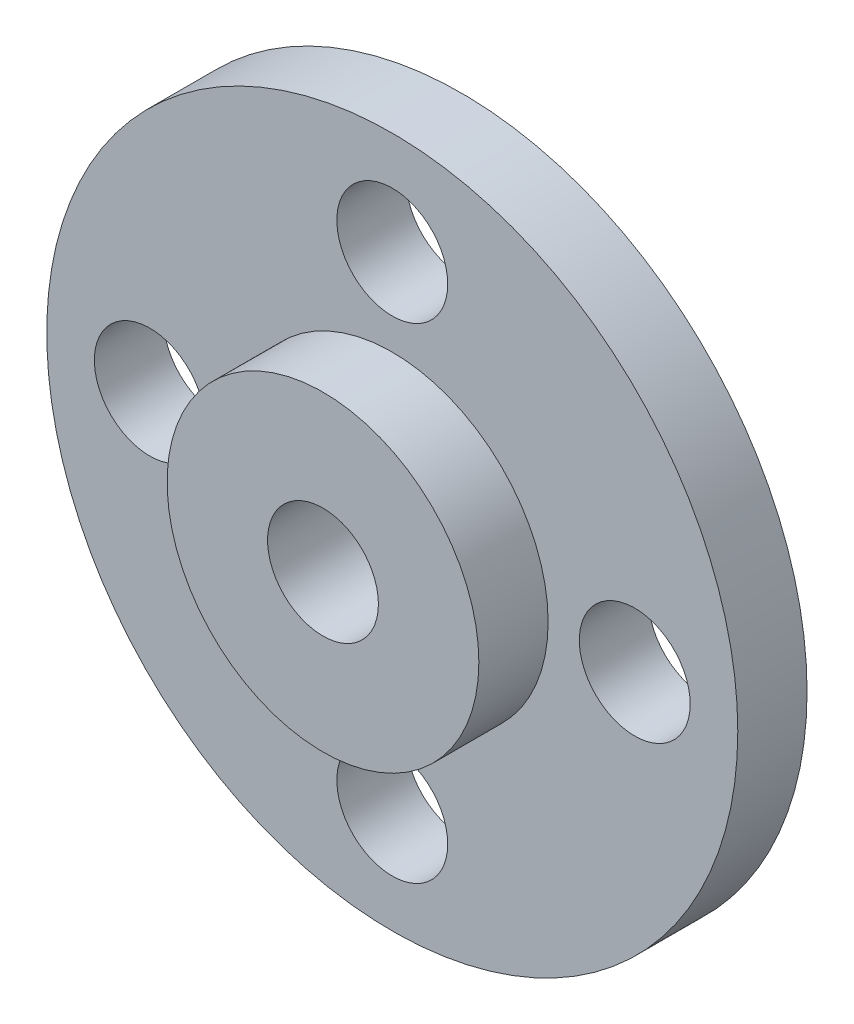
ISO-10303-21;
HEADER;
FILE_DESCRIPTION(('STEP AP214'),'2;1');
FILE_NAME('part.step','',(''),(''),'','','');
FILE_SCHEMA(('AUTOMOTIVE_DESIGN { 1 0 10303 214 1 1 1 1 }'));
ENDSEC;
DATA;
#1=APPLICATION_CONTEXT('core data for automotive mechanical design processes');
#2=APPLICATION_PROTOCOL_DEFINITION('international standard','automotive_design',2000,#1);
#3=PRODUCT_CONTEXT('',#1,'mechanical');
#4=PRODUCT('Part','Part','',(#3));
#5=PRODUCT_RELATED_PRODUCT_CATEGORY('part','',(#4));
#6=PRODUCT_DEFINITION_FORMATION('','',#4);
#7=PRODUCT_DEFINITION_CONTEXT('part definition',#1,'design');
#8=PRODUCT_DEFINITION('design','',#6,#7);
#9=PRODUCT_DEFINITION_SHAPE('','',#8);
#10=(LENGTH_UNIT() NAMED_UNIT(*) SI_UNIT(.MILLI.,.METRE.));
#11=(NAMED_UNIT(*) PLANE_ANGLE_UNIT() SI_UNIT($,.RADIAN.));
#12=(NAMED_UNIT(*) SI_UNIT($,.STERADIAN.) SOLID_ANGLE_UNIT());
#13=UNCERTAINTY_MEASURE_WITH_UNIT(LENGTH_MEASURE(1.E-05),#10,'distance_accuracy_value','');
#14=(GEOMETRIC_REPRESENTATION_CONTEXT(3) GLOBAL_UNCERTAINTY_ASSIGNED_CONTEXT((#13)) GLOBAL_UNIT_ASSIGNED_CONTEXT((#10,
#11,#12)) REPRESENTATION_CONTEXT('',''));
#15=CARTESIAN_POINT('',(0.,0.,0.));
#16=DIRECTION('',(0.,0.,1.));
#17=DIRECTION('',(1.,0.,0.));
#18=AXIS2_PLACEMENT_3D('',#15,#16,#17);
#19=CARTESIAN_POINT('',(0.,0.,2.));
#20=DIRECTION('',(0.,0.,-1.));
#21=DIRECTION('',(-1.,0.,0.));
#22=AXIS2_PLACEMENT_3D('',#19,#20,#21);
#23=CYLINDRICAL_SURFACE('',#22,9.975);
#24=CARTESIAN_POINT('',(0.,0.,2.));
#25=DIRECTION('',(0.,0.,1.));
#26=DIRECTION('',(1.,0.,0.));
#27=AXIS2_PLACEMENT_3D('',#24,#25,#26);
#28=CIRCLE('',#27,9.975);
#29=CARTESIAN_POINT('',(9.975,0.,2.));
#30=VERTEX_POINT('',#29);
#31=EDGE_CURVE('E38',#30,#30,#28,.T.);
#32=ORIENTED_EDGE('',*,*,#31,.F.);
#33=EDGE_LOOP('',(#32));
#34=FACE_BOUND('',#33,.T.);
#35=CARTESIAN_POINT('',(0.,0.,0.));
#36=DIRECTION('',(0.,0.,1.));
#37=DIRECTION('',(1.,0.,0.));
#38=AXIS2_PLACEMENT_3D('',#35,#36,#37);
#39=CIRCLE('',#38,9.975);
#40=CARTESIAN_POINT('',(9.975,0.,0.));
#41=VERTEX_POINT('',#40);
#42=EDGE_CURVE('E34',#41,#41,#39,.T.);
#43=ORIENTED_EDGE('',*,*,#42,.T.);
#44=EDGE_LOOP('',(#43));
#45=FACE_BOUND('',#44,.T.);
#46=ADVANCED_FACE('F31',(#34,#45),#23,.T.);
#47=CARTESIAN_POINT('',(0.,0.,2.));
#48=DIRECTION('',(0.,0.,1.));
#49=DIRECTION('',(1.,0.,0.));
#50=AXIS2_PLACEMENT_3D('',#47,#48,#49);
#51=PLANE('',#50);
#52=CARTESIAN_POINT('',(0.,7.,2.));
#53=DIRECTION('',(0.,0.,1.));
#54=DIRECTION('',(1.,0.,0.));
#55=AXIS2_PLACEMENT_3D('',#52,#53,#54);
#56=CIRCLE('',#55,1.6);
#57=CARTESIAN_POINT('',(1.6,7.,2.));
#58=VERTEX_POINT('',#57);
#59=EDGE_CURVE('E72',#58,#58,#56,.T.);
#60=ORIENTED_EDGE('',*,*,#59,.F.);
#61=EDGE_LOOP('',(#60));
#62=FACE_BOUND('',#61,.T.);
#63=CARTESIAN_POINT('',(0.,-7.,2.));
#64=DIRECTION('',(0.,0.,1.));
#65=DIRECTION('',(1.,0.,0.));
#66=AXIS2_PLACEMENT_3D('',#63,#64,#65);
#67=CIRCLE('',#66,1.6);
#68=CARTESIAN_POINT('',(1.6,-7.,2.));
#69=VERTEX_POINT('',#68);
#70=EDGE_CURVE('E66',#69,#69,#67,.T.);
#71=ORIENTED_EDGE('',*,*,#70,.F.);
#72=EDGE_LOOP('',(#71));
#73=FACE_BOUND('',#72,.T.);
#74=CARTESIAN_POINT('',(-7.,0.,2.));
#75=DIRECTION('',(0.,0.,1.));
#76=DIRECTION('',(1.,0.,0.));
#77=AXIS2_PLACEMENT_3D('',#74,#75,#76);
#78=CIRCLE('',#77,1.6);
#79=CARTESIAN_POINT('',(-5.4,0.,2.));
#80=VERTEX_POINT('',#79);
#81=EDGE_CURVE('E60',#80,#80,#78,.T.);
#82=ORIENTED_EDGE('',*,*,#81,.F.);
#83=EDGE_LOOP('',(#82));
#84=FACE_BOUND('',#83,.T.);
#85=CARTESIAN_POINT('',(7.,0.,2.));
#86=DIRECTION('',(0.,0.,1.));
#87=DIRECTION('',(1.,0.,0.));
#88=AXIS2_PLACEMENT_3D('',#85,#86,#87);
#89=CIRCLE('',#88,1.6);
#90=CARTESIAN_POINT('',(8.6,0.,2.));
#91=VERTEX_POINT('',#90);
#92=EDGE_CURVE('E54',#91,#91,#89,.T.);
#93=ORIENTED_EDGE('',*,*,#92,.F.);
#94=EDGE_LOOP('',(#93));
#95=FACE_BOUND('',#94,.T.);
#96=CARTESIAN_POINT('',(0.,0.,2.));
#97=DIRECTION('',(0.,0.,1.));
#98=DIRECTION('',(1.,0.,0.));
#99=AXIS2_PLACEMENT_3D('',#96,#97,#98);
#100=CIRCLE('',#99,4.5);
#101=CARTESIAN_POINT('',(4.5,0.,2.));
#102=VERTEX_POINT('',#101);
#103=EDGE_CURVE('E10',#102,#102,#100,.T.);
#104=ORIENTED_EDGE('',*,*,#103,.F.);
#105=EDGE_LOOP('',(#104));
#106=FACE_BOUND('',#105,.T.);
#107=ORIENTED_EDGE('',*,*,#31,.T.);
#108=EDGE_LOOP('',(#107));
#109=FACE_BOUND('',#108,.T.);
#110=ADVANCED_FACE('F88',(#62,#73,#84,#95,#106,#109),#51,.T.);
#111=CARTESIAN_POINT('',(0.,0.,0.));
#112=DIRECTION('',(0.,0.,1.));
#113=DIRECTION('',(1.,0.,0.));
#114=AXIS2_PLACEMENT_3D('',#111,#112,#113);
#115=PLANE('',#114);
#116=CARTESIAN_POINT('',(0.,7.,0.));
#117=DIRECTION('',(0.,0.,1.));
#118=DIRECTION('',(1.,0.,0.));
#119=AXIS2_PLACEMENT_3D('',#116,#117,#118);
#120=CIRCLE('',#119,1.6);
#121=CARTESIAN_POINT('',(1.6,7.,0.));
#122=VERTEX_POINT('',#121);
#123=EDGE_CURVE('E51',#122,#122,#120,.T.);
#124=ORIENTED_EDGE('',*,*,#123,.T.);
#125=EDGE_LOOP('',(#124));
#126=FACE_BOUND('',#125,.T.);
#127=CARTESIAN_POINT('',(0.,-7.,0.));
#128=DIRECTION('',(0.,0.,1.));
#129=DIRECTION('',(1.,0.,0.));
#130=AXIS2_PLACEMENT_3D('',#127,#128,#129);
#131=CIRCLE('',#130,1.6);
#132=CARTESIAN_POINT('',(1.6,-7.,0.));
#133=VERTEX_POINT('',#132);
#134=EDGE_CURVE('E69',#133,#133,#131,.T.);
#135=ORIENTED_EDGE('',*,*,#134,.T.);
#136=EDGE_LOOP('',(#135));
#137=FACE_BOUND('',#136,.T.);
#138=CARTESIAN_POINT('',(-7.,0.,0.));
#139=DIRECTION('',(0.,0.,1.));
#140=DIRECTION('',(1.,0.,0.));
#141=AXIS2_PLACEMENT_3D('',#138,#139,#140);
#142=CIRCLE('',#141,1.6);
#143=CARTESIAN_POINT('',(-5.4,0.,0.));
#144=VERTEX_POINT('',#143);
#145=EDGE_CURVE('E63',#144,#144,#142,.T.);
#146=ORIENTED_EDGE('',*,*,#145,.T.);
#147=EDGE_LOOP('',(#146));
#148=FACE_BOUND('',#147,.T.);
#149=CARTESIAN_POINT('',(7.,0.,0.));
#150=DIRECTION('',(0.,0.,1.));
#151=DIRECTION('',(1.,0.,0.));
#152=AXIS2_PLACEMENT_3D('',#149,#150,#151);
#153=CIRCLE('',#152,1.6);
#154=CARTESIAN_POINT('',(8.6,0.,0.));
#155=VERTEX_POINT('',#154);
#156=EDGE_CURVE('E57',#155,#155,#153,.T.);
#157=ORIENTED_EDGE('',*,*,#156,.T.);
#158=EDGE_LOOP('',(#157));
#159=FACE_BOUND('',#158,.T.);
#160=CARTESIAN_POINT('',(0.,0.,0.));
#161=DIRECTION('',(0.,0.,1.));
#162=DIRECTION('',(1.,0.,0.));
#163=AXIS2_PLACEMENT_3D('',#160,#161,#162);
#164=CIRCLE('',#163,1.6);
#165=CARTESIAN_POINT('',(1.6,0.,0.));
#166=VERTEX_POINT('',#165);
#167=EDGE_CURVE('E47',#166,#166,#164,.T.);
#168=ORIENTED_EDGE('',*,*,#167,.T.);
#169=EDGE_LOOP('',(#168));
#170=FACE_BOUND('',#169,.T.);
#171=ORIENTED_EDGE('',*,*,#42,.F.);
#172=EDGE_LOOP('',(#171));
#173=FACE_BOUND('',#172,.T.);
#174=ADVANCED_FACE('F78',(#126,#137,#148,#159,#170,#173),#115,.F.);
#175=CARTESIAN_POINT('',(0.,0.,4.));
#176=DIRECTION('',(0.,0.,-1.));
#177=DIRECTION('',(-1.,0.,0.));
#178=AXIS2_PLACEMENT_3D('',#175,#176,#177);
#179=CYLINDRICAL_SURFACE('',#178,4.5);
#180=CARTESIAN_POINT('',(0.,0.,4.));
#181=DIRECTION('',(0.,0.,1.));
#182=DIRECTION('',(1.,0.,0.));
#183=AXIS2_PLACEMENT_3D('',#180,#181,#182);
#184=CIRCLE('',#183,4.5);
#185=CARTESIAN_POINT('',(4.5,0.,4.));
#186=VERTEX_POINT('',#185);
#187=EDGE_CURVE('E44',#186,#186,#184,.T.);
#188=ORIENTED_EDGE('',*,*,#187,.F.);
#189=EDGE_LOOP('',(#188));
#190=FACE_BOUND('',#189,.T.);
#191=ORIENTED_EDGE('',*,*,#103,.T.);
#192=EDGE_LOOP('',(#191));
#193=FACE_BOUND('',#192,.T.);
#194=ADVANCED_FACE('F107',(#190,#193),#179,.T.);
#195=CARTESIAN_POINT('',(0.,0.,4.));
#196=DIRECTION('',(0.,0.,1.));
#197=DIRECTION('',(1.,0.,0.));
#198=AXIS2_PLACEMENT_3D('',#195,#196,#197);
#199=PLANE('',#198);
#200=CARTESIAN_POINT('',(0.,0.,4.));
#201=DIRECTION('',(0.,0.,1.));
#202=DIRECTION('',(1.,0.,0.));
#203=AXIS2_PLACEMENT_3D('',#200,#201,#202);
#204=CIRCLE('',#203,1.6);
#205=CARTESIAN_POINT('',(1.6,0.,4.));
#206=VERTEX_POINT('',#205);
#207=EDGE_CURVE('E48',#206,#206,#204,.T.);
#208=ORIENTED_EDGE('',*,*,#207,.F.);
#209=EDGE_LOOP('',(#208));
#210=FACE_BOUND('',#209,.T.);
#211=ORIENTED_EDGE('',*,*,#187,.T.);
#212=EDGE_LOOP('',(#211));
#213=FACE_BOUND('',#212,.T.);
#214=ADVANCED_FACE('F111',(#210,#213),#199,.T.);
#215=CARTESIAN_POINT('',(0.,0.,0.));
#216=DIRECTION('',(0.,0.,1.));
#217=DIRECTION('',(1.,0.,0.));
#218=AXIS2_PLACEMENT_3D('',#215,#216,#217);
#219=CYLINDRICAL_SURFACE('',#218,1.6);
#220=ORIENTED_EDGE('',*,*,#167,.F.);
#221=EDGE_LOOP('',(#220));
#222=FACE_BOUND('',#221,.T.);
#223=ORIENTED_EDGE('',*,*,#207,.T.);
#224=EDGE_LOOP('',(#223));
#225=FACE_BOUND('',#224,.T.);
#226=ADVANCED_FACE('F117',(#222,#225),#219,.F.);
#227=CARTESIAN_POINT('',(7.,0.,0.));
#228=DIRECTION('',(0.,0.,1.));
#229=DIRECTION('',(1.,0.,0.));
#230=AXIS2_PLACEMENT_3D('',#227,#228,#229);
#231=CYLINDRICAL_SURFACE('',#230,1.6);
#232=ORIENTED_EDGE('',*,*,#156,.F.);
#233=EDGE_LOOP('',(#232));
#234=FACE_BOUND('',#233,.T.);
#235=ORIENTED_EDGE('',*,*,#92,.T.);
#236=EDGE_LOOP('',(#235));
#237=FACE_BOUND('',#236,.T.);
#238=ADVANCED_FACE('F121',(#234,#237),#231,.F.);
#239=CARTESIAN_POINT('',(-7.,0.,0.));
#240=DIRECTION('',(0.,0.,1.));
#241=DIRECTION('',(1.,0.,0.));
#242=AXIS2_PLACEMENT_3D('',#239,#240,#241);
#243=CYLINDRICAL_SURFACE('',#242,1.6);
#244=ORIENTED_EDGE('',*,*,#145,.F.);
#245=EDGE_LOOP('',(#244));
#246=FACE_BOUND('',#245,.T.);
#247=ORIENTED_EDGE('',*,*,#81,.T.);
#248=EDGE_LOOP('',(#247));
#249=FACE_BOUND('',#248,.T.);
#250=ADVANCED_FACE('F125',(#246,#249),#243,.F.);
#251=CARTESIAN_POINT('',(0.,-7.,0.));
#252=DIRECTION('',(0.,0.,1.));
#253=DIRECTION('',(1.,0.,0.));
#254=AXIS2_PLACEMENT_3D('',#251,#252,#253);
#255=CYLINDRICAL_SURFACE('',#254,1.6);
#256=ORIENTED_EDGE('',*,*,#134,.F.);
#257=EDGE_LOOP('',(#256));
#258=FACE_BOUND('',#257,.T.);
#259=ORIENTED_EDGE('',*,*,#70,.T.);
#260=EDGE_LOOP('',(#259));
#261=FACE_BOUND('',#260,.T.);
#262=ADVANCED_FACE('F84',(#258,#261),#255,.F.);
#263=CARTESIAN_POINT('',(0.,7.,0.));
#264=DIRECTION('',(0.,0.,1.));
#265=DIRECTION('',(1.,0.,0.));
#266=AXIS2_PLACEMENT_3D('',#263,#264,#265);
#267=CYLINDRICAL_SURFACE('',#266,1.6);
#268=ORIENTED_EDGE('',*,*,#123,.F.);
#269=EDGE_LOOP('',(#268));
#270=FACE_BOUND('',#269,.T.);
#271=ORIENTED_EDGE('',*,*,#59,.T.);
#272=EDGE_LOOP('',(#271));
#273=FACE_BOUND('',#272,.T.);
#274=ADVANCED_FACE('F81',(#270,#273),#267,.F.);
#275=CLOSED_SHELL('',(#46,#110,#174,#194,#214,#226,#238,#250,#262,#274));
#276=MANIFOLD_SOLID_BREP('B2',#275);
#277=ADVANCED_BREP_SHAPE_REPRESENTATION('',(#18,#276),#14);
#278=SHAPE_DEFINITION_REPRESENTATION(#9,#277);
ENDSEC;
END-ISO-10303-21;
